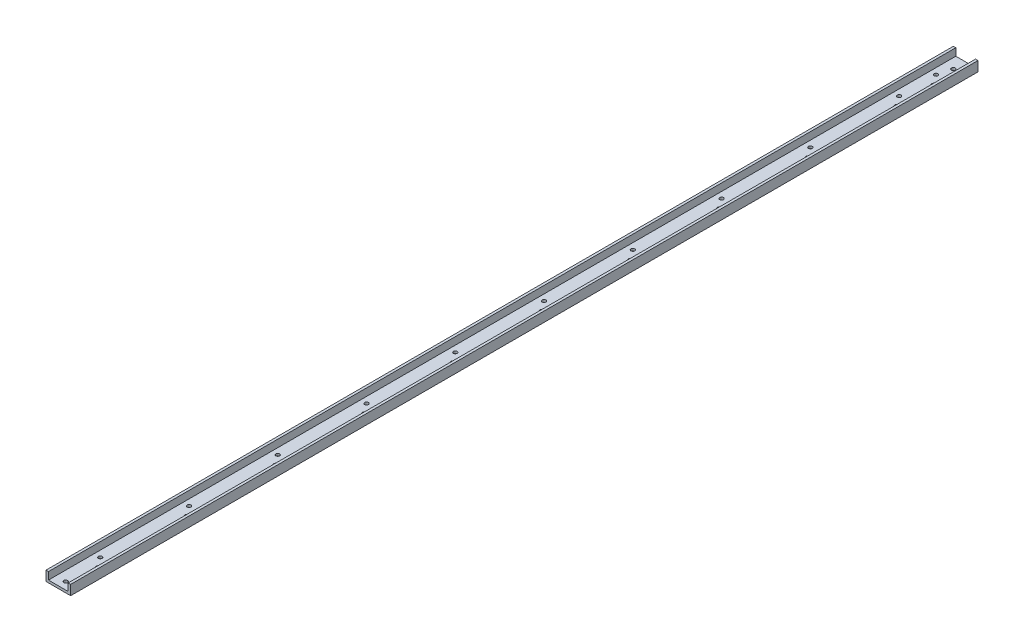
ISO-10303-21;
HEADER;
FILE_DESCRIPTION(('STEP AP214'),'2;1');
FILE_NAME('part.step','',(''),(''),'','','');
FILE_SCHEMA(('AUTOMOTIVE_DESIGN { 1 0 10303 214 1 1 1 1 }'));
ENDSEC;
DATA;
#1=APPLICATION_CONTEXT('core data for automotive mechanical design processes');
#2=APPLICATION_PROTOCOL_DEFINITION('international standard','automotive_design',2000,#1);
#3=PRODUCT_CONTEXT('',#1,'mechanical');
#4=PRODUCT('Part','Part','',(#3));
#5=PRODUCT_RELATED_PRODUCT_CATEGORY('part','',(#4));
#6=PRODUCT_DEFINITION_FORMATION('','',#4);
#7=PRODUCT_DEFINITION_CONTEXT('part definition',#1,'design');
#8=PRODUCT_DEFINITION('design','',#6,#7);
#9=PRODUCT_DEFINITION_SHAPE('','',#8);
#10=(LENGTH_UNIT() NAMED_UNIT(*) SI_UNIT(.MILLI.,.METRE.));
#11=(NAMED_UNIT(*) PLANE_ANGLE_UNIT() SI_UNIT($,.RADIAN.));
#12=(NAMED_UNIT(*) SI_UNIT($,.STERADIAN.) SOLID_ANGLE_UNIT());
#13=UNCERTAINTY_MEASURE_WITH_UNIT(LENGTH_MEASURE(1.E-05),#10,'distance_accuracy_value','');
#14=(GEOMETRIC_REPRESENTATION_CONTEXT(3) GLOBAL_UNCERTAINTY_ASSIGNED_CONTEXT((#13)) GLOBAL_UNIT_ASSIGNED_CONTEXT((#10,
#11,#12)) REPRESENTATION_CONTEXT('',''));
#15=CARTESIAN_POINT('',(0.,0.,0.));
#16=DIRECTION('',(0.,0.,1.));
#17=DIRECTION('',(1.,0.,0.));
#18=AXIS2_PLACEMENT_3D('',#15,#16,#17);
#19=CARTESIAN_POINT('',(20.6375,-0.00100000000000013,93.6624999999999));
#20=DIRECTION('',(0.,1.,0.));
#21=DIRECTION('',(0.,0.,1.));
#22=AXIS2_PLACEMENT_3D('',#19,#20,#21);
#23=CYLINDRICAL_SURFACE('',#22,2.41300000000001);
#24=CARTESIAN_POINT('',(20.6375,3.175,93.6624999999999));
#25=DIRECTION('',(0.,1.,0.));
#26=DIRECTION('',(0.,0.,1.));
#27=AXIS2_PLACEMENT_3D('',#24,#25,#26);
#28=CIRCLE('',#27,2.41300000000001);
#29=CARTESIAN_POINT('',(20.6375,3.175,96.0754999999999));
#30=VERTEX_POINT('',#29);
#31=EDGE_CURVE('E47',#30,#30,#28,.T.);
#32=ORIENTED_EDGE('',*,*,#31,.T.);
#33=EDGE_LOOP('',(#32));
#34=FACE_BOUND('',#33,.T.);
#35=CARTESIAN_POINT('',(20.6375,0.,93.6624999999999));
#36=DIRECTION('',(0.,1.,0.));
#37=DIRECTION('',(0.,0.,1.));
#38=AXIS2_PLACEMENT_3D('',#35,#36,#37);
#39=CIRCLE('',#38,2.41300000000001);
#40=CARTESIAN_POINT('',(20.6375,0.,96.0754999999999));
#41=VERTEX_POINT('',#40);
#42=EDGE_CURVE('E11',#41,#41,#39,.F.);
#43=ORIENTED_EDGE('',*,*,#42,.T.);
#44=EDGE_LOOP('',(#43));
#45=FACE_BOUND('',#44,.T.);
#46=ADVANCED_FACE('F39',(#34,#45),#23,.F.);
#47=CARTESIAN_POINT('',(20.6375,-0.00100000000000013,207.9625));
#48=DIRECTION('',(0.,1.,0.));
#49=DIRECTION('',(0.,0.,1.));
#50=AXIS2_PLACEMENT_3D('',#47,#48,#49);
#51=CYLINDRICAL_SURFACE('',#50,2.41300000000001);
#52=CARTESIAN_POINT('',(20.6375,3.175,207.9625));
#53=DIRECTION('',(0.,1.,0.));
#54=DIRECTION('',(0.,0.,1.));
#55=AXIS2_PLACEMENT_3D('',#52,#53,#54);
#56=CIRCLE('',#55,2.41300000000001);
#57=CARTESIAN_POINT('',(20.6375,3.175,210.3755));
#58=VERTEX_POINT('',#57);
#59=EDGE_CURVE('E268',#58,#58,#56,.T.);
#60=ORIENTED_EDGE('',*,*,#59,.T.);
#61=EDGE_LOOP('',(#60));
#62=FACE_BOUND('',#61,.T.);
#63=CARTESIAN_POINT('',(20.6375,0.,207.9625));
#64=DIRECTION('',(0.,1.,0.));
#65=DIRECTION('',(0.,0.,1.));
#66=AXIS2_PLACEMENT_3D('',#63,#64,#65);
#67=CIRCLE('',#66,2.41300000000001);
#68=CARTESIAN_POINT('',(20.6375,0.,210.3755));
#69=VERTEX_POINT('',#68);
#70=EDGE_CURVE('E271',#69,#69,#67,.F.);
#71=ORIENTED_EDGE('',*,*,#70,.T.);
#72=EDGE_LOOP('',(#71));
#73=FACE_BOUND('',#72,.T.);
#74=ADVANCED_FACE('F294',(#62,#73),#51,.F.);
#75=CARTESIAN_POINT('',(20.6375,-0.00100000000000013,322.2625));
#76=DIRECTION('',(0.,1.,0.));
#77=DIRECTION('',(0.,0.,1.));
#78=AXIS2_PLACEMENT_3D('',#75,#76,#77);
#79=CYLINDRICAL_SURFACE('',#78,2.41300000000001);
#80=CARTESIAN_POINT('',(20.6375,3.175,322.2625));
#81=DIRECTION('',(0.,1.,0.));
#82=DIRECTION('',(0.,0.,1.));
#83=AXIS2_PLACEMENT_3D('',#80,#81,#82);
#84=CIRCLE('',#83,2.41300000000001);
#85=CARTESIAN_POINT('',(20.6375,3.175,324.6755));
#86=VERTEX_POINT('',#85);
#87=EDGE_CURVE('E262',#86,#86,#84,.T.);
#88=ORIENTED_EDGE('',*,*,#87,.T.);
#89=EDGE_LOOP('',(#88));
#90=FACE_BOUND('',#89,.T.);
#91=CARTESIAN_POINT('',(20.6375,0.,322.2625));
#92=DIRECTION('',(0.,1.,0.));
#93=DIRECTION('',(0.,0.,1.));
#94=AXIS2_PLACEMENT_3D('',#91,#92,#93);
#95=CIRCLE('',#94,2.41300000000001);
#96=CARTESIAN_POINT('',(20.6375,0.,324.6755));
#97=VERTEX_POINT('',#96);
#98=EDGE_CURVE('E265',#97,#97,#95,.F.);
#99=ORIENTED_EDGE('',*,*,#98,.T.);
#100=EDGE_LOOP('',(#99));
#101=FACE_BOUND('',#100,.T.);
#102=ADVANCED_FACE('F298',(#90,#101),#79,.F.);
#103=CARTESIAN_POINT('',(20.6375,-0.00100000000000013,436.5625));
#104=DIRECTION('',(0.,1.,0.));
#105=DIRECTION('',(0.,0.,1.));
#106=AXIS2_PLACEMENT_3D('',#103,#104,#105);
#107=CYLINDRICAL_SURFACE('',#106,2.41300000000001);
#108=CARTESIAN_POINT('',(20.6375,3.175,436.5625));
#109=DIRECTION('',(0.,1.,0.));
#110=DIRECTION('',(0.,0.,1.));
#111=AXIS2_PLACEMENT_3D('',#108,#109,#110);
#112=CIRCLE('',#111,2.41300000000001);
#113=CARTESIAN_POINT('',(20.6375,3.175,438.9755));
#114=VERTEX_POINT('',#113);
#115=EDGE_CURVE('E256',#114,#114,#112,.T.);
#116=ORIENTED_EDGE('',*,*,#115,.T.);
#117=EDGE_LOOP('',(#116));
#118=FACE_BOUND('',#117,.T.);
#119=CARTESIAN_POINT('',(20.6375,0.,436.5625));
#120=DIRECTION('',(0.,1.,0.));
#121=DIRECTION('',(0.,0.,1.));
#122=AXIS2_PLACEMENT_3D('',#119,#120,#121);
#123=CIRCLE('',#122,2.41300000000001);
#124=CARTESIAN_POINT('',(20.6375,0.,438.9755));
#125=VERTEX_POINT('',#124);
#126=EDGE_CURVE('E259',#125,#125,#123,.F.);
#127=ORIENTED_EDGE('',*,*,#126,.T.);
#128=EDGE_LOOP('',(#127));
#129=FACE_BOUND('',#128,.T.);
#130=ADVANCED_FACE('F303',(#118,#129),#107,.F.);
#131=CARTESIAN_POINT('',(20.6375,-0.00100000000000013,550.8625));
#132=DIRECTION('',(0.,1.,0.));
#133=DIRECTION('',(0.,0.,1.));
#134=AXIS2_PLACEMENT_3D('',#131,#132,#133);
#135=CYLINDRICAL_SURFACE('',#134,2.41300000000001);
#136=CARTESIAN_POINT('',(20.6375,3.175,550.8625));
#137=DIRECTION('',(0.,1.,0.));
#138=DIRECTION('',(0.,0.,1.));
#139=AXIS2_PLACEMENT_3D('',#136,#137,#138);
#140=CIRCLE('',#139,2.41300000000001);
#141=CARTESIAN_POINT('',(20.6375,3.175,553.2755));
#142=VERTEX_POINT('',#141);
#143=EDGE_CURVE('E250',#142,#142,#140,.T.);
#144=ORIENTED_EDGE('',*,*,#143,.T.);
#145=EDGE_LOOP('',(#144));
#146=FACE_BOUND('',#145,.T.);
#147=CARTESIAN_POINT('',(20.6375,0.,550.8625));
#148=DIRECTION('',(0.,1.,0.));
#149=DIRECTION('',(0.,0.,1.));
#150=AXIS2_PLACEMENT_3D('',#147,#148,#149);
#151=CIRCLE('',#150,2.41300000000001);
#152=CARTESIAN_POINT('',(20.6375,0.,553.2755));
#153=VERTEX_POINT('',#152);
#154=EDGE_CURVE('E253',#153,#153,#151,.F.);
#155=ORIENTED_EDGE('',*,*,#154,.T.);
#156=EDGE_LOOP('',(#155));
#157=FACE_BOUND('',#156,.T.);
#158=ADVANCED_FACE('F310',(#146,#157),#135,.F.);
#159=CARTESIAN_POINT('',(20.6375,-0.00100000000000013,665.1625));
#160=DIRECTION('',(0.,1.,0.));
#161=DIRECTION('',(0.,0.,1.));
#162=AXIS2_PLACEMENT_3D('',#159,#160,#161);
#163=CYLINDRICAL_SURFACE('',#162,2.41300000000001);
#164=CARTESIAN_POINT('',(20.6375,3.175,665.1625));
#165=DIRECTION('',(0.,1.,0.));
#166=DIRECTION('',(0.,0.,1.));
#167=AXIS2_PLACEMENT_3D('',#164,#165,#166);
#168=CIRCLE('',#167,2.41300000000001);
#169=CARTESIAN_POINT('',(20.6375,3.175,667.5755));
#170=VERTEX_POINT('',#169);
#171=EDGE_CURVE('E244',#170,#170,#168,.T.);
#172=ORIENTED_EDGE('',*,*,#171,.T.);
#173=EDGE_LOOP('',(#172));
#174=FACE_BOUND('',#173,.T.);
#175=CARTESIAN_POINT('',(20.6375,0.,665.1625));
#176=DIRECTION('',(0.,1.,0.));
#177=DIRECTION('',(0.,0.,1.));
#178=AXIS2_PLACEMENT_3D('',#175,#176,#177);
#179=CIRCLE('',#178,2.41300000000001);
#180=CARTESIAN_POINT('',(20.6375,0.,667.5755));
#181=VERTEX_POINT('',#180);
#182=EDGE_CURVE('E247',#181,#181,#179,.F.);
#183=ORIENTED_EDGE('',*,*,#182,.T.);
#184=EDGE_LOOP('',(#183));
#185=FACE_BOUND('',#184,.T.);
#186=ADVANCED_FACE('F314',(#174,#185),#163,.F.);
#187=CARTESIAN_POINT('',(20.6375,-0.00100000000000013,779.4625));
#188=DIRECTION('',(0.,1.,0.));
#189=DIRECTION('',(0.,0.,1.));
#190=AXIS2_PLACEMENT_3D('',#187,#188,#189);
#191=CYLINDRICAL_SURFACE('',#190,2.41300000000001);
#192=CARTESIAN_POINT('',(20.6375,3.175,779.4625));
#193=DIRECTION('',(0.,1.,0.));
#194=DIRECTION('',(0.,0.,1.));
#195=AXIS2_PLACEMENT_3D('',#192,#193,#194);
#196=CIRCLE('',#195,2.41300000000001);
#197=CARTESIAN_POINT('',(20.6375,3.175,781.8755));
#198=VERTEX_POINT('',#197);
#199=EDGE_CURVE('E238',#198,#198,#196,.T.);
#200=ORIENTED_EDGE('',*,*,#199,.T.);
#201=EDGE_LOOP('',(#200));
#202=FACE_BOUND('',#201,.T.);
#203=CARTESIAN_POINT('',(20.6375,0.,779.4625));
#204=DIRECTION('',(0.,1.,0.));
#205=DIRECTION('',(0.,0.,1.));
#206=AXIS2_PLACEMENT_3D('',#203,#204,#205);
#207=CIRCLE('',#206,2.41300000000001);
#208=CARTESIAN_POINT('',(20.6375,0.,781.8755));
#209=VERTEX_POINT('',#208);
#210=EDGE_CURVE('E241',#209,#209,#207,.F.);
#211=ORIENTED_EDGE('',*,*,#210,.T.);
#212=EDGE_LOOP('',(#211));
#213=FACE_BOUND('',#212,.T.);
#214=ADVANCED_FACE('F318',(#202,#213),#191,.F.);
#215=CARTESIAN_POINT('',(20.6375,-0.00100000000000013,893.7625));
#216=DIRECTION('',(0.,1.,0.));
#217=DIRECTION('',(0.,0.,1.));
#218=AXIS2_PLACEMENT_3D('',#215,#216,#217);
#219=CYLINDRICAL_SURFACE('',#218,2.41300000000001);
#220=CARTESIAN_POINT('',(20.6375,3.175,893.7625));
#221=DIRECTION('',(0.,1.,0.));
#222=DIRECTION('',(0.,0.,1.));
#223=AXIS2_PLACEMENT_3D('',#220,#221,#222);
#224=CIRCLE('',#223,2.41300000000001);
#225=CARTESIAN_POINT('',(20.6375,3.175,896.1755));
#226=VERTEX_POINT('',#225);
#227=EDGE_CURVE('E232',#226,#226,#224,.T.);
#228=ORIENTED_EDGE('',*,*,#227,.T.);
#229=EDGE_LOOP('',(#228));
#230=FACE_BOUND('',#229,.T.);
#231=CARTESIAN_POINT('',(20.6375,0.,893.7625));
#232=DIRECTION('',(0.,1.,0.));
#233=DIRECTION('',(0.,0.,1.));
#234=AXIS2_PLACEMENT_3D('',#231,#232,#233);
#235=CIRCLE('',#234,2.41300000000001);
#236=CARTESIAN_POINT('',(20.6375,0.,896.1755));
#237=VERTEX_POINT('',#236);
#238=EDGE_CURVE('E235',#237,#237,#235,.F.);
#239=ORIENTED_EDGE('',*,*,#238,.T.);
#240=EDGE_LOOP('',(#239));
#241=FACE_BOUND('',#240,.T.);
#242=ADVANCED_FACE('F322',(#230,#241),#219,.F.);
#243=CARTESIAN_POINT('',(11.1125,-0.00100000000000013,80.9625));
#244=DIRECTION('',(0.,1.,0.));
#245=DIRECTION('',(0.,0.,1.));
#246=AXIS2_PLACEMENT_3D('',#243,#244,#245);
#247=CYLINDRICAL_SURFACE('',#246,2.41300000000005);
#248=CARTESIAN_POINT('',(11.1125,3.175,80.9625));
#249=DIRECTION('',(0.,1.,0.));
#250=DIRECTION('',(0.,0.,1.));
#251=AXIS2_PLACEMENT_3D('',#248,#249,#250);
#252=CIRCLE('',#251,2.41300000000005);
#253=CARTESIAN_POINT('',(11.1125,3.175,83.3755000000001));
#254=VERTEX_POINT('',#253);
#255=EDGE_CURVE('E226',#254,#254,#252,.T.);
#256=ORIENTED_EDGE('',*,*,#255,.T.);
#257=EDGE_LOOP('',(#256));
#258=FACE_BOUND('',#257,.T.);
#259=CARTESIAN_POINT('',(11.1125,0.,80.9625));
#260=DIRECTION('',(0.,1.,0.));
#261=DIRECTION('',(0.,0.,1.));
#262=AXIS2_PLACEMENT_3D('',#259,#260,#261);
#263=CIRCLE('',#262,2.41300000000005);
#264=CARTESIAN_POINT('',(11.1125,0.,83.3755000000001));
#265=VERTEX_POINT('',#264);
#266=EDGE_CURVE('E229',#265,#265,#263,.F.);
#267=ORIENTED_EDGE('',*,*,#266,.T.);
#268=EDGE_LOOP('',(#267));
#269=FACE_BOUND('',#268,.T.);
#270=ADVANCED_FACE('F326',(#258,#269),#247,.F.);
#271=CARTESIAN_POINT('',(11.1125,-0.00100000000000013,195.2625));
#272=DIRECTION('',(0.,1.,0.));
#273=DIRECTION('',(0.,0.,1.));
#274=AXIS2_PLACEMENT_3D('',#271,#272,#273);
#275=CYLINDRICAL_SURFACE('',#274,2.41300000000005);
#276=CARTESIAN_POINT('',(11.1125,3.175,195.2625));
#277=DIRECTION('',(0.,1.,0.));
#278=DIRECTION('',(0.,0.,1.));
#279=AXIS2_PLACEMENT_3D('',#276,#277,#278);
#280=CIRCLE('',#279,2.41300000000005);
#281=CARTESIAN_POINT('',(11.1125,3.175,197.6755));
#282=VERTEX_POINT('',#281);
#283=EDGE_CURVE('E220',#282,#282,#280,.T.);
#284=ORIENTED_EDGE('',*,*,#283,.T.);
#285=EDGE_LOOP('',(#284));
#286=FACE_BOUND('',#285,.T.);
#287=CARTESIAN_POINT('',(11.1125,0.,195.2625));
#288=DIRECTION('',(0.,1.,0.));
#289=DIRECTION('',(0.,0.,1.));
#290=AXIS2_PLACEMENT_3D('',#287,#288,#289);
#291=CIRCLE('',#290,2.41300000000005);
#292=CARTESIAN_POINT('',(11.1125,0.,197.6755));
#293=VERTEX_POINT('',#292);
#294=EDGE_CURVE('E223',#293,#293,#291,.F.);
#295=ORIENTED_EDGE('',*,*,#294,.T.);
#296=EDGE_LOOP('',(#295));
#297=FACE_BOUND('',#296,.T.);
#298=ADVANCED_FACE('F330',(#286,#297),#275,.F.);
#299=CARTESIAN_POINT('',(11.1125,-0.00100000000000013,309.5625));
#300=DIRECTION('',(0.,1.,0.));
#301=DIRECTION('',(0.,0.,1.));
#302=AXIS2_PLACEMENT_3D('',#299,#300,#301);
#303=CYLINDRICAL_SURFACE('',#302,2.41300000000005);
#304=CARTESIAN_POINT('',(11.1125,3.175,309.5625));
#305=DIRECTION('',(0.,1.,0.));
#306=DIRECTION('',(0.,0.,1.));
#307=AXIS2_PLACEMENT_3D('',#304,#305,#306);
#308=CIRCLE('',#307,2.41300000000005);
#309=CARTESIAN_POINT('',(11.1125,3.175,311.9755));
#310=VERTEX_POINT('',#309);
#311=EDGE_CURVE('E214',#310,#310,#308,.T.);
#312=ORIENTED_EDGE('',*,*,#311,.T.);
#313=EDGE_LOOP('',(#312));
#314=FACE_BOUND('',#313,.T.);
#315=CARTESIAN_POINT('',(11.1125,0.,309.5625));
#316=DIRECTION('',(0.,1.,0.));
#317=DIRECTION('',(0.,0.,1.));
#318=AXIS2_PLACEMENT_3D('',#315,#316,#317);
#319=CIRCLE('',#318,2.41300000000005);
#320=CARTESIAN_POINT('',(11.1125,0.,311.9755));
#321=VERTEX_POINT('',#320);
#322=EDGE_CURVE('E217',#321,#321,#319,.F.);
#323=ORIENTED_EDGE('',*,*,#322,.T.);
#324=EDGE_LOOP('',(#323));
#325=FACE_BOUND('',#324,.T.);
#326=ADVANCED_FACE('F334',(#314,#325),#303,.F.);
#327=CARTESIAN_POINT('',(11.1125,-0.00100000000000013,423.8625));
#328=DIRECTION('',(0.,1.,0.));
#329=DIRECTION('',(0.,0.,1.));
#330=AXIS2_PLACEMENT_3D('',#327,#328,#329);
#331=CYLINDRICAL_SURFACE('',#330,2.41300000000005);
#332=CARTESIAN_POINT('',(11.1125,3.175,423.8625));
#333=DIRECTION('',(0.,1.,0.));
#334=DIRECTION('',(0.,0.,1.));
#335=AXIS2_PLACEMENT_3D('',#332,#333,#334);
#336=CIRCLE('',#335,2.41300000000005);
#337=CARTESIAN_POINT('',(11.1125,3.175,426.2755));
#338=VERTEX_POINT('',#337);
#339=EDGE_CURVE('E208',#338,#338,#336,.T.);
#340=ORIENTED_EDGE('',*,*,#339,.T.);
#341=EDGE_LOOP('',(#340));
#342=FACE_BOUND('',#341,.T.);
#343=CARTESIAN_POINT('',(11.1125,0.,423.8625));
#344=DIRECTION('',(0.,1.,0.));
#345=DIRECTION('',(0.,0.,1.));
#346=AXIS2_PLACEMENT_3D('',#343,#344,#345);
#347=CIRCLE('',#346,2.41300000000005);
#348=CARTESIAN_POINT('',(11.1125,0.,426.2755));
#349=VERTEX_POINT('',#348);
#350=EDGE_CURVE('E211',#349,#349,#347,.F.);
#351=ORIENTED_EDGE('',*,*,#350,.T.);
#352=EDGE_LOOP('',(#351));
#353=FACE_BOUND('',#352,.T.);
#354=ADVANCED_FACE('F338',(#342,#353),#331,.F.);
#355=CARTESIAN_POINT('',(11.1125,-0.00100000000000013,538.1625));
#356=DIRECTION('',(0.,1.,0.));
#357=DIRECTION('',(0.,0.,1.));
#358=AXIS2_PLACEMENT_3D('',#355,#356,#357);
#359=CYLINDRICAL_SURFACE('',#358,2.41300000000005);
#360=CARTESIAN_POINT('',(11.1125,3.175,538.1625));
#361=DIRECTION('',(0.,1.,0.));
#362=DIRECTION('',(0.,0.,1.));
#363=AXIS2_PLACEMENT_3D('',#360,#361,#362);
#364=CIRCLE('',#363,2.41300000000005);
#365=CARTESIAN_POINT('',(11.1125,3.175,540.5755));
#366=VERTEX_POINT('',#365);
#367=EDGE_CURVE('E202',#366,#366,#364,.T.);
#368=ORIENTED_EDGE('',*,*,#367,.T.);
#369=EDGE_LOOP('',(#368));
#370=FACE_BOUND('',#369,.T.);
#371=CARTESIAN_POINT('',(11.1125,0.,538.1625));
#372=DIRECTION('',(0.,1.,0.));
#373=DIRECTION('',(0.,0.,1.));
#374=AXIS2_PLACEMENT_3D('',#371,#372,#373);
#375=CIRCLE('',#374,2.41300000000005);
#376=CARTESIAN_POINT('',(11.1125,0.,540.5755));
#377=VERTEX_POINT('',#376);
#378=EDGE_CURVE('E205',#377,#377,#375,.F.);
#379=ORIENTED_EDGE('',*,*,#378,.T.);
#380=EDGE_LOOP('',(#379));
#381=FACE_BOUND('',#380,.T.);
#382=ADVANCED_FACE('F342',(#370,#381),#359,.F.);
#383=CARTESIAN_POINT('',(11.1125,-0.00100000000000013,652.4625));
#384=DIRECTION('',(0.,1.,0.));
#385=DIRECTION('',(0.,0.,1.));
#386=AXIS2_PLACEMENT_3D('',#383,#384,#385);
#387=CYLINDRICAL_SURFACE('',#386,2.41300000000005);
#388=CARTESIAN_POINT('',(11.1125,3.175,652.4625));
#389=DIRECTION('',(0.,1.,0.));
#390=DIRECTION('',(0.,0.,1.));
#391=AXIS2_PLACEMENT_3D('',#388,#389,#390);
#392=CIRCLE('',#391,2.41300000000005);
#393=CARTESIAN_POINT('',(11.1125,3.175,654.8755));
#394=VERTEX_POINT('',#393);
#395=EDGE_CURVE('E196',#394,#394,#392,.T.);
#396=ORIENTED_EDGE('',*,*,#395,.T.);
#397=EDGE_LOOP('',(#396));
#398=FACE_BOUND('',#397,.T.);
#399=CARTESIAN_POINT('',(11.1125,0.,652.4625));
#400=DIRECTION('',(0.,1.,0.));
#401=DIRECTION('',(0.,0.,1.));
#402=AXIS2_PLACEMENT_3D('',#399,#400,#401);
#403=CIRCLE('',#402,2.41300000000005);
#404=CARTESIAN_POINT('',(11.1125,0.,654.8755));
#405=VERTEX_POINT('',#404);
#406=EDGE_CURVE('E199',#405,#405,#403,.F.);
#407=ORIENTED_EDGE('',*,*,#406,.T.);
#408=EDGE_LOOP('',(#407));
#409=FACE_BOUND('',#408,.T.);
#410=ADVANCED_FACE('F346',(#398,#409),#387,.F.);
#411=CARTESIAN_POINT('',(11.1125,-0.00100000000000013,766.7625));
#412=DIRECTION('',(0.,1.,0.));
#413=DIRECTION('',(0.,0.,1.));
#414=AXIS2_PLACEMENT_3D('',#411,#412,#413);
#415=CYLINDRICAL_SURFACE('',#414,2.41300000000005);
#416=CARTESIAN_POINT('',(11.1125,3.175,766.7625));
#417=DIRECTION('',(0.,1.,0.));
#418=DIRECTION('',(0.,0.,1.));
#419=AXIS2_PLACEMENT_3D('',#416,#417,#418);
#420=CIRCLE('',#419,2.41300000000005);
#421=CARTESIAN_POINT('',(11.1125,3.175,769.1755));
#422=VERTEX_POINT('',#421);
#423=EDGE_CURVE('E190',#422,#422,#420,.T.);
#424=ORIENTED_EDGE('',*,*,#423,.T.);
#425=EDGE_LOOP('',(#424));
#426=FACE_BOUND('',#425,.T.);
#427=CARTESIAN_POINT('',(11.1125,0.,766.7625));
#428=DIRECTION('',(0.,1.,0.));
#429=DIRECTION('',(0.,0.,1.));
#430=AXIS2_PLACEMENT_3D('',#427,#428,#429);
#431=CIRCLE('',#430,2.41300000000005);
#432=CARTESIAN_POINT('',(11.1125,0.,769.1755));
#433=VERTEX_POINT('',#432);
#434=EDGE_CURVE('E193',#433,#433,#431,.F.);
#435=ORIENTED_EDGE('',*,*,#434,.T.);
#436=EDGE_LOOP('',(#435));
#437=FACE_BOUND('',#436,.T.);
#438=ADVANCED_FACE('F350',(#426,#437),#415,.F.);
#439=CARTESIAN_POINT('',(11.1125,-0.00100000000000013,881.0625));
#440=DIRECTION('',(0.,1.,0.));
#441=DIRECTION('',(0.,0.,1.));
#442=AXIS2_PLACEMENT_3D('',#439,#440,#441);
#443=CYLINDRICAL_SURFACE('',#442,2.41300000000005);
#444=CARTESIAN_POINT('',(11.1125,3.175,881.0625));
#445=DIRECTION('',(0.,1.,0.));
#446=DIRECTION('',(0.,0.,1.));
#447=AXIS2_PLACEMENT_3D('',#444,#445,#446);
#448=CIRCLE('',#447,2.41300000000005);
#449=CARTESIAN_POINT('',(11.1125,3.175,883.4755));
#450=VERTEX_POINT('',#449);
#451=EDGE_CURVE('E184',#450,#450,#448,.T.);
#452=ORIENTED_EDGE('',*,*,#451,.T.);
#453=EDGE_LOOP('',(#452));
#454=FACE_BOUND('',#453,.T.);
#455=CARTESIAN_POINT('',(11.1125,0.,881.0625));
#456=DIRECTION('',(0.,1.,0.));
#457=DIRECTION('',(0.,0.,1.));
#458=AXIS2_PLACEMENT_3D('',#455,#456,#457);
#459=CIRCLE('',#458,2.41300000000005);
#460=CARTESIAN_POINT('',(11.1125,0.,883.4755));
#461=VERTEX_POINT('',#460);
#462=EDGE_CURVE('E187',#461,#461,#459,.F.);
#463=ORIENTED_EDGE('',*,*,#462,.T.);
#464=EDGE_LOOP('',(#463));
#465=FACE_BOUND('',#464,.T.);
#466=ADVANCED_FACE('F354',(#454,#465),#443,.F.);
#467=CARTESIAN_POINT('',(0.,0.,1168.4));
#468=DIRECTION('',(1.,0.,0.));
#469=DIRECTION('',(0.,0.,-1.));
#470=AXIS2_PLACEMENT_3D('',#467,#468,#469);
#471=PLANE('',#470);
#472=DIRECTION('',(0.,-1.,0.));
#473=VECTOR('',#472,1.);
#474=CARTESIAN_POINT('',(0.,0.,0.));
#475=LINE('',#474,#473);
#476=CARTESIAN_POINT('',(0.,12.7,0.));
#477=VERTEX_POINT('',#476);
#478=CARTESIAN_POINT('',(0.,0.,0.));
#479=VERTEX_POINT('',#478);
#480=EDGE_CURVE('E142',#477,#479,#475,.T.);
#481=ORIENTED_EDGE('',*,*,#480,.T.);
#482=DIRECTION('',(0.,0.,-1.));
#483=VECTOR('',#482,1.);
#484=CARTESIAN_POINT('',(0.,0.,1168.4));
#485=LINE('',#484,#483);
#486=CARTESIAN_POINT('',(0.,0.,1168.4));
#487=VERTEX_POINT('',#486);
#488=EDGE_CURVE('E181',#487,#479,#485,.T.);
#489=ORIENTED_EDGE('',*,*,#488,.F.);
#490=DIRECTION('',(0.,-1.,0.));
#491=VECTOR('',#490,1.);
#492=CARTESIAN_POINT('',(0.,0.,1168.4));
#493=LINE('',#492,#491);
#494=CARTESIAN_POINT('',(0.,12.7,1168.4));
#495=VERTEX_POINT('',#494);
#496=EDGE_CURVE('E162',#495,#487,#493,.T.);
#497=ORIENTED_EDGE('',*,*,#496,.F.);
#498=DIRECTION('',(0.,0.,-1.));
#499=VECTOR('',#498,1.);
#500=CARTESIAN_POINT('',(0.,12.7,1168.4));
#501=LINE('',#500,#499);
#502=EDGE_CURVE('E138',#495,#477,#501,.T.);
#503=ORIENTED_EDGE('',*,*,#502,.T.);
#504=EDGE_LOOP('',(#481,#489,#497,#503));
#505=FACE_BOUND('',#504,.T.);
#506=ADVANCED_FACE('F358',(#505),#471,.F.);
#507=CARTESIAN_POINT('',(0.,0.,1168.4));
#508=DIRECTION('',(0.,1.,0.));
#509=DIRECTION('',(0.,0.,1.));
#510=AXIS2_PLACEMENT_3D('',#507,#508,#509);
#511=PLANE('',#510);
#512=CARTESIAN_POINT('',(15.875,0.,15.875));
#513=DIRECTION('',(0.,1.,0.));
#514=DIRECTION('',(0.,0.,1.));
#515=AXIS2_PLACEMENT_3D('',#512,#513,#514);
#516=CIRCLE('',#515,2.413);
#517=CARTESIAN_POINT('',(15.875,0.,18.288));
#518=VERTEX_POINT('',#517);
#519=EDGE_CURVE('E430',#518,#518,#516,.F.);
#520=ORIENTED_EDGE('',*,*,#519,.F.);
#521=EDGE_LOOP('',(#520));
#522=FACE_BOUND('',#521,.T.);
#523=CARTESIAN_POINT('',(11.1125000000001,0.,33.3374999999999));
#524=DIRECTION('',(0.,-1.,0.));
#525=DIRECTION('',(0.,0.,-1.));
#526=AXIS2_PLACEMENT_3D('',#523,#524,#525);
#527=CIRCLE('',#526,2.413);
#528=CARTESIAN_POINT('',(11.1125000000001,0.,30.9245));
#529=VERTEX_POINT('',#528);
#530=EDGE_CURVE('E440',#529,#529,#527,.T.);
#531=ORIENTED_EDGE('',*,*,#530,.F.);
#532=EDGE_LOOP('',(#531));
#533=FACE_BOUND('',#532,.T.);
#534=CARTESIAN_POINT('',(20.6375000000001,0.,46.0374999999999));
#535=DIRECTION('',(0.,-1.,0.));
#536=DIRECTION('',(0.,0.,-1.));
#537=AXIS2_PLACEMENT_3D('',#534,#535,#536);
#538=CIRCLE('',#537,2.413);
#539=CARTESIAN_POINT('',(20.6375000000001,0.,43.6244999999999));
#540=VERTEX_POINT('',#539);
#541=EDGE_CURVE('E432',#540,#540,#538,.T.);
#542=ORIENTED_EDGE('',*,*,#541,.F.);
#543=EDGE_LOOP('',(#542));
#544=FACE_BOUND('',#543,.T.);
#545=CARTESIAN_POINT('',(20.6375,0.,1008.0625));
#546=DIRECTION('',(0.,1.,0.));
#547=DIRECTION('',(0.,0.,1.));
#548=AXIS2_PLACEMENT_3D('',#545,#546,#547);
#549=CIRCLE('',#548,2.41300000000001);
#550=CARTESIAN_POINT('',(20.6375,0.,1010.4755));
#551=VERTEX_POINT('',#550);
#552=EDGE_CURVE('E451',#551,#551,#549,.F.);
#553=ORIENTED_EDGE('',*,*,#552,.F.);
#554=EDGE_LOOP('',(#553));
#555=FACE_BOUND('',#554,.T.);
#556=CARTESIAN_POINT('',(11.1125,0.,995.3625));
#557=DIRECTION('',(0.,1.,0.));
#558=DIRECTION('',(0.,0.,1.));
#559=AXIS2_PLACEMENT_3D('',#556,#557,#558);
#560=CIRCLE('',#559,2.41300000000005);
#561=CARTESIAN_POINT('',(11.1125,0.,997.7755));
#562=VERTEX_POINT('',#561);
#563=EDGE_CURVE('E457',#562,#562,#560,.F.);
#564=ORIENTED_EDGE('',*,*,#563,.F.);
#565=EDGE_LOOP('',(#564));
#566=FACE_BOUND('',#565,.T.);
#567=CARTESIAN_POINT('',(15.875,0.,1158.875));
#568=DIRECTION('',(0.,1.,0.));
#569=DIRECTION('',(0.,0.,1.));
#570=AXIS2_PLACEMENT_3D('',#567,#568,#569);
#571=CIRCLE('',#570,2.41299999999998);
#572=CARTESIAN_POINT('',(15.875,0.,1161.288));
#573=VERTEX_POINT('',#572);
#574=EDGE_CURVE('E463',#573,#573,#571,.F.);
#575=ORIENTED_EDGE('',*,*,#574,.F.);
#576=EDGE_LOOP('',(#575));
#577=FACE_BOUND('',#576,.T.);
#578=CARTESIAN_POINT('',(11.1125,0.,1109.6625));
#579=DIRECTION('',(0.,1.,0.));
#580=DIRECTION('',(0.,0.,1.));
#581=AXIS2_PLACEMENT_3D('',#578,#579,#580);
#582=CIRCLE('',#581,2.41300000000005);
#583=CARTESIAN_POINT('',(11.1125,0.,1112.0755));
#584=VERTEX_POINT('',#583);
#585=EDGE_CURVE('E146',#584,#584,#582,.F.);
#586=ORIENTED_EDGE('',*,*,#585,.F.);
#587=EDGE_LOOP('',(#586));
#588=FACE_BOUND('',#587,.T.);
#589=CARTESIAN_POINT('',(20.6375,0.,1122.3625));
#590=DIRECTION('',(0.,1.,0.));
#591=DIRECTION('',(0.,0.,1.));
#592=AXIS2_PLACEMENT_3D('',#589,#590,#591);
#593=CIRCLE('',#592,2.41300000000001);
#594=CARTESIAN_POINT('',(20.6375,0.,1124.7755));
#595=VERTEX_POINT('',#594);
#596=EDGE_CURVE('E470',#595,#595,#593,.F.);
#597=ORIENTED_EDGE('',*,*,#596,.F.);
#598=EDGE_LOOP('',(#597));
#599=FACE_BOUND('',#598,.T.);
#600=DIRECTION('',(1.,0.,0.));
#601=VECTOR('',#600,1.);
#602=CARTESIAN_POINT('',(0.,0.,0.));
#603=LINE('',#602,#601);
#604=CARTESIAN_POINT('',(31.75,0.,0.));
#605=VERTEX_POINT('',#604);
#606=EDGE_CURVE('E145',#479,#605,#603,.T.);
#607=ORIENTED_EDGE('',*,*,#606,.T.);
#608=DIRECTION('',(0.,0.,-1.));
#609=VECTOR('',#608,1.);
#610=CARTESIAN_POINT('',(31.75,0.,1168.4));
#611=LINE('',#610,#609);
#612=CARTESIAN_POINT('',(31.75,0.,1168.4));
#613=VERTEX_POINT('',#612);
#614=EDGE_CURVE('E177',#613,#605,#611,.T.);
#615=ORIENTED_EDGE('',*,*,#614,.F.);
#616=DIRECTION('',(1.,0.,0.));
#617=VECTOR('',#616,1.);
#618=CARTESIAN_POINT('',(0.,0.,1168.4));
#619=LINE('',#618,#617);
#620=EDGE_CURVE('E103',#487,#613,#619,.T.);
#621=ORIENTED_EDGE('',*,*,#620,.F.);
#622=ORIENTED_EDGE('',*,*,#488,.T.);
#623=EDGE_LOOP('',(#607,#615,#621,#622));
#624=FACE_BOUND('',#623,.T.);
#625=ORIENTED_EDGE('',*,*,#462,.F.);
#626=EDGE_LOOP('',(#625));
#627=FACE_BOUND('',#626,.T.);
#628=ORIENTED_EDGE('',*,*,#434,.F.);
#629=EDGE_LOOP('',(#628));
#630=FACE_BOUND('',#629,.T.);
#631=ORIENTED_EDGE('',*,*,#406,.F.);
#632=EDGE_LOOP('',(#631));
#633=FACE_BOUND('',#632,.T.);
#634=ORIENTED_EDGE('',*,*,#378,.F.);
#635=EDGE_LOOP('',(#634));
#636=FACE_BOUND('',#635,.T.);
#637=ORIENTED_EDGE('',*,*,#350,.F.);
#638=EDGE_LOOP('',(#637));
#639=FACE_BOUND('',#638,.T.);
#640=ORIENTED_EDGE('',*,*,#322,.F.);
#641=EDGE_LOOP('',(#640));
#642=FACE_BOUND('',#641,.T.);
#643=ORIENTED_EDGE('',*,*,#294,.F.);
#644=EDGE_LOOP('',(#643));
#645=FACE_BOUND('',#644,.T.);
#646=ORIENTED_EDGE('',*,*,#266,.F.);
#647=EDGE_LOOP('',(#646));
#648=FACE_BOUND('',#647,.T.);
#649=ORIENTED_EDGE('',*,*,#238,.F.);
#650=EDGE_LOOP('',(#649));
#651=FACE_BOUND('',#650,.T.);
#652=ORIENTED_EDGE('',*,*,#210,.F.);
#653=EDGE_LOOP('',(#652));
#654=FACE_BOUND('',#653,.T.);
#655=ORIENTED_EDGE('',*,*,#182,.F.);
#656=EDGE_LOOP('',(#655));
#657=FACE_BOUND('',#656,.T.);
#658=ORIENTED_EDGE('',*,*,#154,.F.);
#659=EDGE_LOOP('',(#658));
#660=FACE_BOUND('',#659,.T.);
#661=ORIENTED_EDGE('',*,*,#126,.F.);
#662=EDGE_LOOP('',(#661));
#663=FACE_BOUND('',#662,.T.);
#664=ORIENTED_EDGE('',*,*,#98,.F.);
#665=EDGE_LOOP('',(#664));
#666=FACE_BOUND('',#665,.T.);
#667=ORIENTED_EDGE('',*,*,#70,.F.);
#668=EDGE_LOOP('',(#667));
#669=FACE_BOUND('',#668,.T.);
#670=ORIENTED_EDGE('',*,*,#42,.F.);
#671=EDGE_LOOP('',(#670));
#672=FACE_BOUND('',#671,.T.);
#673=ADVANCED_FACE('F362',(#522,#533,#544,#555,#566,#577,#588,#599,#624,#627,#630,#633,#636,
#639,#642,#645,#648,#651,#654,#657,#660,#663,#666,#669,#672),#511,.F.);
#674=CARTESIAN_POINT('',(31.75,0.,1168.4));
#675=DIRECTION('',(-1.,0.,0.));
#676=DIRECTION('',(0.,0.,1.));
#677=AXIS2_PLACEMENT_3D('',#674,#675,#676);
#678=PLANE('',#677);
#679=DIRECTION('',(0.,1.,0.));
#680=VECTOR('',#679,1.);
#681=CARTESIAN_POINT('',(31.75,0.,0.));
#682=LINE('',#681,#680);
#683=CARTESIAN_POINT('',(31.75,12.7,0.));
#684=VERTEX_POINT('',#683);
#685=EDGE_CURVE('E149',#605,#684,#682,.T.);
#686=ORIENTED_EDGE('',*,*,#685,.T.);
#687=DIRECTION('',(0.,0.,-1.));
#688=VECTOR('',#687,1.);
#689=CARTESIAN_POINT('',(31.75,12.7,1168.4));
#690=LINE('',#689,#688);
#691=CARTESIAN_POINT('',(31.75,12.7,1168.4));
#692=VERTEX_POINT('',#691);
#693=EDGE_CURVE('E173',#692,#684,#690,.T.);
#694=ORIENTED_EDGE('',*,*,#693,.F.);
#695=DIRECTION('',(0.,1.,0.));
#696=VECTOR('',#695,1.);
#697=CARTESIAN_POINT('',(31.75,0.,1168.4));
#698=LINE('',#697,#696);
#699=EDGE_CURVE('E479',#613,#692,#698,.T.);
#700=ORIENTED_EDGE('',*,*,#699,.F.);
#701=ORIENTED_EDGE('',*,*,#614,.T.);
#702=EDGE_LOOP('',(#686,#694,#700,#701));
#703=FACE_BOUND('',#702,.T.);
#704=ADVANCED_FACE('F365',(#703),#678,.F.);
#705=CARTESIAN_POINT('',(31.75,12.7,1168.4));
#706=DIRECTION('',(0.,-1.,0.));
#707=DIRECTION('',(0.,0.,-1.));
#708=AXIS2_PLACEMENT_3D('',#705,#706,#707);
#709=PLANE('',#708);
#710=DIRECTION('',(-1.,0.,0.));
#711=VECTOR('',#710,1.);
#712=CARTESIAN_POINT('',(31.75,12.7,0.));
#713=LINE('',#712,#711);
#714=CARTESIAN_POINT('',(28.575,12.7,0.));
#715=VERTEX_POINT('',#714);
#716=EDGE_CURVE('E152',#684,#715,#713,.T.);
#717=ORIENTED_EDGE('',*,*,#716,.T.);
#718=DIRECTION('',(0.,0.,-1.));
#719=VECTOR('',#718,1.);
#720=CARTESIAN_POINT('',(28.575,12.7,1168.4));
#721=LINE('',#720,#719);
#722=CARTESIAN_POINT('',(28.575,12.7,1168.4));
#723=VERTEX_POINT('',#722);
#724=EDGE_CURVE('E169',#723,#715,#721,.T.);
#725=ORIENTED_EDGE('',*,*,#724,.F.);
#726=DIRECTION('',(-1.,0.,0.));
#727=VECTOR('',#726,1.);
#728=CARTESIAN_POINT('',(31.75,12.7,1168.4));
#729=LINE('',#728,#727);
#730=EDGE_CURVE('E481',#692,#723,#729,.T.);
#731=ORIENTED_EDGE('',*,*,#730,.F.);
#732=ORIENTED_EDGE('',*,*,#693,.T.);
#733=EDGE_LOOP('',(#717,#725,#731,#732));
#734=FACE_BOUND('',#733,.T.);
#735=ADVANCED_FACE('F288',(#734),#709,.F.);
#736=CARTESIAN_POINT('',(28.575,3.175,1168.4));
#737=DIRECTION('',(1.,0.,0.));
#738=DIRECTION('',(0.,0.,-1.));
#739=AXIS2_PLACEMENT_3D('',#736,#737,#738);
#740=PLANE('',#739);
#741=DIRECTION('',(0.,-1.,0.));
#742=VECTOR('',#741,1.);
#743=CARTESIAN_POINT('',(28.575,3.175,0.));
#744=LINE('',#743,#742);
#745=CARTESIAN_POINT('',(28.575,3.175,0.));
#746=VERTEX_POINT('',#745);
#747=EDGE_CURVE('E155',#715,#746,#744,.T.);
#748=ORIENTED_EDGE('',*,*,#747,.T.);
#749=DIRECTION('',(0.,0.,-1.));
#750=VECTOR('',#749,1.);
#751=CARTESIAN_POINT('',(28.575,3.175,1168.4));
#752=LINE('',#751,#750);
#753=CARTESIAN_POINT('',(28.575,3.175,1168.4));
#754=VERTEX_POINT('',#753);
#755=EDGE_CURVE('E133',#754,#746,#752,.T.);
#756=ORIENTED_EDGE('',*,*,#755,.F.);
#757=DIRECTION('',(0.,-1.,0.));
#758=VECTOR('',#757,1.);
#759=CARTESIAN_POINT('',(28.575,3.175,1168.4));
#760=LINE('',#759,#758);
#761=EDGE_CURVE('E122',#723,#754,#760,.T.);
#762=ORIENTED_EDGE('',*,*,#761,.F.);
#763=ORIENTED_EDGE('',*,*,#724,.T.);
#764=EDGE_LOOP('',(#748,#756,#762,#763));
#765=FACE_BOUND('',#764,.T.);
#766=ADVANCED_FACE('F279',(#765),#740,.F.);
#767=CARTESIAN_POINT('',(3.175,3.175,1168.4));
#768=DIRECTION('',(0.,-1.,0.));
#769=DIRECTION('',(0.,0.,-1.));
#770=AXIS2_PLACEMENT_3D('',#767,#768,#769);
#771=PLANE('',#770);
#772=CARTESIAN_POINT('',(15.875,3.175,15.875));
#773=DIRECTION('',(0.,1.,0.));
#774=DIRECTION('',(0.,0.,1.));
#775=AXIS2_PLACEMENT_3D('',#772,#773,#774);
#776=CIRCLE('',#775,2.413);
#777=CARTESIAN_POINT('',(15.875,3.175,18.288));
#778=VERTEX_POINT('',#777);
#779=EDGE_CURVE('E427',#778,#778,#776,.T.);
#780=ORIENTED_EDGE('',*,*,#779,.F.);
#781=EDGE_LOOP('',(#780));
#782=FACE_BOUND('',#781,.T.);
#783=CARTESIAN_POINT('',(11.1125000000001,3.175,33.3374999999999));
#784=DIRECTION('',(0.,-1.,0.));
#785=DIRECTION('',(0.,0.,-1.));
#786=AXIS2_PLACEMENT_3D('',#783,#784,#785);
#787=CIRCLE('',#786,2.413);
#788=CARTESIAN_POINT('',(11.1125000000001,3.175,30.9245));
#789=VERTEX_POINT('',#788);
#790=EDGE_CURVE('E443',#789,#789,#787,.F.);
#791=ORIENTED_EDGE('',*,*,#790,.F.);
#792=EDGE_LOOP('',(#791));
#793=FACE_BOUND('',#792,.T.);
#794=CARTESIAN_POINT('',(20.6375000000001,3.175,46.0374999999999));
#795=DIRECTION('',(0.,-1.,0.));
#796=DIRECTION('',(0.,0.,-1.));
#797=AXIS2_PLACEMENT_3D('',#794,#795,#796);
#798=CIRCLE('',#797,2.413);
#799=CARTESIAN_POINT('',(20.6375000000001,3.175,43.6244999999999));
#800=VERTEX_POINT('',#799);
#801=EDGE_CURVE('E436',#800,#800,#798,.F.);
#802=ORIENTED_EDGE('',*,*,#801,.F.);
#803=EDGE_LOOP('',(#802));
#804=FACE_BOUND('',#803,.T.);
#805=CARTESIAN_POINT('',(20.6375,3.175,1008.0625));
#806=DIRECTION('',(0.,1.,0.));
#807=DIRECTION('',(0.,0.,1.));
#808=AXIS2_PLACEMENT_3D('',#805,#806,#807);
#809=CIRCLE('',#808,2.41300000000001);
#810=CARTESIAN_POINT('',(20.6375,3.175,1010.4755));
#811=VERTEX_POINT('',#810);
#812=EDGE_CURVE('E445',#811,#811,#809,.T.);
#813=ORIENTED_EDGE('',*,*,#812,.F.);
#814=EDGE_LOOP('',(#813));
#815=FACE_BOUND('',#814,.T.);
#816=CARTESIAN_POINT('',(11.1125,3.175,995.3625));
#817=DIRECTION('',(0.,1.,0.));
#818=DIRECTION('',(0.,0.,1.));
#819=AXIS2_PLACEMENT_3D('',#816,#817,#818);
#820=CIRCLE('',#819,2.41300000000005);
#821=CARTESIAN_POINT('',(11.1125,3.175,997.7755));
#822=VERTEX_POINT('',#821);
#823=EDGE_CURVE('E454',#822,#822,#820,.T.);
#824=ORIENTED_EDGE('',*,*,#823,.F.);
#825=EDGE_LOOP('',(#824));
#826=FACE_BOUND('',#825,.T.);
#827=CARTESIAN_POINT('',(15.875,3.175,1158.875));
#828=DIRECTION('',(0.,1.,0.));
#829=DIRECTION('',(0.,0.,1.));
#830=AXIS2_PLACEMENT_3D('',#827,#828,#829);
#831=CIRCLE('',#830,2.41299999999998);
#832=CARTESIAN_POINT('',(15.875,3.175,1161.288));
#833=VERTEX_POINT('',#832);
#834=EDGE_CURVE('E460',#833,#833,#831,.T.);
#835=ORIENTED_EDGE('',*,*,#834,.F.);
#836=EDGE_LOOP('',(#835));
#837=FACE_BOUND('',#836,.T.);
#838=CARTESIAN_POINT('',(11.1125,3.175,1109.6625));
#839=DIRECTION('',(0.,1.,0.));
#840=DIRECTION('',(0.,0.,1.));
#841=AXIS2_PLACEMENT_3D('',#838,#839,#840);
#842=CIRCLE('',#841,2.41300000000005);
#843=CARTESIAN_POINT('',(11.1125,3.175,1112.0755));
#844=VERTEX_POINT('',#843);
#845=EDGE_CURVE('E467',#844,#844,#842,.T.);
#846=ORIENTED_EDGE('',*,*,#845,.F.);
#847=EDGE_LOOP('',(#846));
#848=FACE_BOUND('',#847,.T.);
#849=CARTESIAN_POINT('',(20.6375,3.175,1122.3625));
#850=DIRECTION('',(0.,1.,0.));
#851=DIRECTION('',(0.,0.,1.));
#852=AXIS2_PLACEMENT_3D('',#849,#850,#851);
#853=CIRCLE('',#852,2.41300000000001);
#854=CARTESIAN_POINT('',(20.6375,3.175,1124.7755));
#855=VERTEX_POINT('',#854);
#856=EDGE_CURVE('E466',#855,#855,#853,.T.);
#857=ORIENTED_EDGE('',*,*,#856,.F.);
#858=EDGE_LOOP('',(#857));
#859=FACE_BOUND('',#858,.T.);
#860=DIRECTION('',(-1.,0.,0.));
#861=VECTOR('',#860,1.);
#862=CARTESIAN_POINT('',(3.175,3.175,0.));
#863=LINE('',#862,#861);
#864=CARTESIAN_POINT('',(3.175,3.175,0.));
#865=VERTEX_POINT('',#864);
#866=EDGE_CURVE('E131',#746,#865,#863,.T.);
#867=ORIENTED_EDGE('',*,*,#866,.T.);
#868=DIRECTION('',(0.,0.,-1.));
#869=VECTOR('',#868,1.);
#870=CARTESIAN_POINT('',(3.175,3.175,1168.4));
#871=LINE('',#870,#869);
#872=CARTESIAN_POINT('',(3.175,3.175,1168.4));
#873=VERTEX_POINT('',#872);
#874=EDGE_CURVE('E127',#873,#865,#871,.T.);
#875=ORIENTED_EDGE('',*,*,#874,.F.);
#876=DIRECTION('',(-1.,0.,0.));
#877=VECTOR('',#876,1.);
#878=CARTESIAN_POINT('',(3.175,3.175,1168.4));
#879=LINE('',#878,#877);
#880=EDGE_CURVE('E116',#754,#873,#879,.T.);
#881=ORIENTED_EDGE('',*,*,#880,.F.);
#882=ORIENTED_EDGE('',*,*,#755,.T.);
#883=EDGE_LOOP('',(#867,#875,#881,#882));
#884=FACE_BOUND('',#883,.T.);
#885=ORIENTED_EDGE('',*,*,#451,.F.);
#886=EDGE_LOOP('',(#885));
#887=FACE_BOUND('',#886,.T.);
#888=ORIENTED_EDGE('',*,*,#423,.F.);
#889=EDGE_LOOP('',(#888));
#890=FACE_BOUND('',#889,.T.);
#891=ORIENTED_EDGE('',*,*,#395,.F.);
#892=EDGE_LOOP('',(#891));
#893=FACE_BOUND('',#892,.T.);
#894=ORIENTED_EDGE('',*,*,#367,.F.);
#895=EDGE_LOOP('',(#894));
#896=FACE_BOUND('',#895,.T.);
#897=ORIENTED_EDGE('',*,*,#339,.F.);
#898=EDGE_LOOP('',(#897));
#899=FACE_BOUND('',#898,.T.);
#900=ORIENTED_EDGE('',*,*,#311,.F.);
#901=EDGE_LOOP('',(#900));
#902=FACE_BOUND('',#901,.T.);
#903=ORIENTED_EDGE('',*,*,#283,.F.);
#904=EDGE_LOOP('',(#903));
#905=FACE_BOUND('',#904,.T.);
#906=ORIENTED_EDGE('',*,*,#255,.F.);
#907=EDGE_LOOP('',(#906));
#908=FACE_BOUND('',#907,.T.);
#909=ORIENTED_EDGE('',*,*,#227,.F.);
#910=EDGE_LOOP('',(#909));
#911=FACE_BOUND('',#910,.T.);
#912=ORIENTED_EDGE('',*,*,#199,.F.);
#913=EDGE_LOOP('',(#912));
#914=FACE_BOUND('',#913,.T.);
#915=ORIENTED_EDGE('',*,*,#171,.F.);
#916=EDGE_LOOP('',(#915));
#917=FACE_BOUND('',#916,.T.);
#918=ORIENTED_EDGE('',*,*,#143,.F.);
#919=EDGE_LOOP('',(#918));
#920=FACE_BOUND('',#919,.T.);
#921=ORIENTED_EDGE('',*,*,#115,.F.);
#922=EDGE_LOOP('',(#921));
#923=FACE_BOUND('',#922,.T.);
#924=ORIENTED_EDGE('',*,*,#87,.F.);
#925=EDGE_LOOP('',(#924));
#926=FACE_BOUND('',#925,.T.);
#927=ORIENTED_EDGE('',*,*,#59,.F.);
#928=EDGE_LOOP('',(#927));
#929=FACE_BOUND('',#928,.T.);
#930=ORIENTED_EDGE('',*,*,#31,.F.);
#931=EDGE_LOOP('',(#930));
#932=FACE_BOUND('',#931,.T.);
#933=ADVANCED_FACE('F128',(#782,#793,#804,#815,#826,#837,#848,#859,#884,#887,#890,#893,#896,
#899,#902,#905,#908,#911,#914,#917,#920,#923,#926,#929,#932),#771,.F.);
#934=CARTESIAN_POINT('',(3.175,3.175,1168.4));
#935=DIRECTION('',(-1.,0.,0.));
#936=DIRECTION('',(0.,0.,1.));
#937=AXIS2_PLACEMENT_3D('',#934,#935,#936);
#938=PLANE('',#937);
#939=DIRECTION('',(0.,1.,0.));
#940=VECTOR('',#939,1.);
#941=CARTESIAN_POINT('',(3.175,3.175,0.));
#942=LINE('',#941,#940);
#943=CARTESIAN_POINT('',(3.175,12.7,0.));
#944=VERTEX_POINT('',#943);
#945=EDGE_CURVE('E88',#865,#944,#942,.T.);
#946=ORIENTED_EDGE('',*,*,#945,.T.);
#947=DIRECTION('',(0.,0.,-1.));
#948=VECTOR('',#947,1.);
#949=CARTESIAN_POINT('',(3.175,12.7,1168.4));
#950=LINE('',#949,#948);
#951=CARTESIAN_POINT('',(3.175,12.7,1168.4));
#952=VERTEX_POINT('',#951);
#953=EDGE_CURVE('E134',#952,#944,#950,.T.);
#954=ORIENTED_EDGE('',*,*,#953,.F.);
#955=DIRECTION('',(0.,1.,0.));
#956=VECTOR('',#955,1.);
#957=CARTESIAN_POINT('',(3.175,3.175,1168.4));
#958=LINE('',#957,#956);
#959=EDGE_CURVE('E120',#873,#952,#958,.T.);
#960=ORIENTED_EDGE('',*,*,#959,.F.);
#961=ORIENTED_EDGE('',*,*,#874,.T.);
#962=EDGE_LOOP('',(#946,#954,#960,#961));
#963=FACE_BOUND('',#962,.T.);
#964=ADVANCED_FACE('F136',(#963),#938,.F.);
#965=CARTESIAN_POINT('',(0.,12.7,1168.4));
#966=DIRECTION('',(0.,-1.,0.));
#967=DIRECTION('',(0.,0.,-1.));
#968=AXIS2_PLACEMENT_3D('',#965,#966,#967);
#969=PLANE('',#968);
#970=DIRECTION('',(-1.,0.,0.));
#971=VECTOR('',#970,1.);
#972=CARTESIAN_POINT('',(0.,12.7,0.));
#973=LINE('',#972,#971);
#974=EDGE_CURVE('E94',#944,#477,#973,.T.);
#975=ORIENTED_EDGE('',*,*,#974,.T.);
#976=ORIENTED_EDGE('',*,*,#502,.F.);
#977=DIRECTION('',(-1.,0.,0.));
#978=VECTOR('',#977,1.);
#979=CARTESIAN_POINT('',(0.,12.7,1168.4));
#980=LINE('',#979,#978);
#981=EDGE_CURVE('E55',#952,#495,#980,.T.);
#982=ORIENTED_EDGE('',*,*,#981,.F.);
#983=ORIENTED_EDGE('',*,*,#953,.T.);
#984=EDGE_LOOP('',(#975,#976,#982,#983));
#985=FACE_BOUND('',#984,.T.);
#986=ADVANCED_FACE('F285',(#985),#969,.F.);
#987=CARTESIAN_POINT('',(0.,0.,1168.4));
#988=DIRECTION('',(0.,0.,-1.));
#989=DIRECTION('',(-1.,0.,0.));
#990=AXIS2_PLACEMENT_3D('',#987,#988,#989);
#991=PLANE('',#990);
#992=ORIENTED_EDGE('',*,*,#496,.T.);
#993=ORIENTED_EDGE('',*,*,#620,.T.);
#994=ORIENTED_EDGE('',*,*,#699,.T.);
#995=ORIENTED_EDGE('',*,*,#730,.T.);
#996=ORIENTED_EDGE('',*,*,#761,.T.);
#997=ORIENTED_EDGE('',*,*,#880,.T.);
#998=ORIENTED_EDGE('',*,*,#959,.T.);
#999=ORIENTED_EDGE('',*,*,#981,.T.);
#1000=EDGE_LOOP('',(#992,#993,#994,#995,#996,#997,#998,#999));
#1001=FACE_BOUND('',#1000,.T.);
#1002=ADVANCED_FACE('F118',(#1001),#991,.F.);
#1003=CARTESIAN_POINT('',(0.,0.,0.));
#1004=DIRECTION('',(0.,0.,-1.));
#1005=DIRECTION('',(-1.,0.,0.));
#1006=AXIS2_PLACEMENT_3D('',#1003,#1004,#1005);
#1007=PLANE('',#1006);
#1008=ORIENTED_EDGE('',*,*,#480,.F.);
#1009=ORIENTED_EDGE('',*,*,#974,.F.);
#1010=ORIENTED_EDGE('',*,*,#945,.F.);
#1011=ORIENTED_EDGE('',*,*,#866,.F.);
#1012=ORIENTED_EDGE('',*,*,#747,.F.);
#1013=ORIENTED_EDGE('',*,*,#716,.F.);
#1014=ORIENTED_EDGE('',*,*,#685,.F.);
#1015=ORIENTED_EDGE('',*,*,#606,.F.);
#1016=EDGE_LOOP('',(#1008,#1009,#1010,#1011,#1012,#1013,#1014,#1015));
#1017=FACE_BOUND('',#1016,.T.);
#1018=ADVANCED_FACE('F381',(#1017),#1007,.T.);
#1019=CARTESIAN_POINT('',(20.6375,-0.00100000000000013,1122.3625));
#1020=DIRECTION('',(0.,1.,0.));
#1021=DIRECTION('',(0.,0.,1.));
#1022=AXIS2_PLACEMENT_3D('',#1019,#1020,#1021);
#1023=CYLINDRICAL_SURFACE('',#1022,2.41300000000001);
#1024=ORIENTED_EDGE('',*,*,#856,.T.);
#1025=EDGE_LOOP('',(#1024));
#1026=FACE_BOUND('',#1025,.T.);
#1027=ORIENTED_EDGE('',*,*,#596,.T.);
#1028=EDGE_LOOP('',(#1027));
#1029=FACE_BOUND('',#1028,.T.);
#1030=ADVANCED_FACE('F391',(#1026,#1029),#1023,.F.);
#1031=CARTESIAN_POINT('',(11.1125,-0.00100000000000013,1109.6625));
#1032=DIRECTION('',(0.,1.,0.));
#1033=DIRECTION('',(0.,0.,1.));
#1034=AXIS2_PLACEMENT_3D('',#1031,#1032,#1033);
#1035=CYLINDRICAL_SURFACE('',#1034,2.41300000000005);
#1036=ORIENTED_EDGE('',*,*,#845,.T.);
#1037=EDGE_LOOP('',(#1036));
#1038=FACE_BOUND('',#1037,.T.);
#1039=ORIENTED_EDGE('',*,*,#585,.T.);
#1040=EDGE_LOOP('',(#1039));
#1041=FACE_BOUND('',#1040,.T.);
#1042=ADVANCED_FACE('F395',(#1038,#1041),#1035,.F.);
#1043=CARTESIAN_POINT('',(15.875,-0.00100000000000013,1158.875));
#1044=DIRECTION('',(0.,1.,0.));
#1045=DIRECTION('',(0.,0.,1.));
#1046=AXIS2_PLACEMENT_3D('',#1043,#1044,#1045);
#1047=CYLINDRICAL_SURFACE('',#1046,2.41299999999998);
#1048=ORIENTED_EDGE('',*,*,#834,.T.);
#1049=EDGE_LOOP('',(#1048));
#1050=FACE_BOUND('',#1049,.T.);
#1051=ORIENTED_EDGE('',*,*,#574,.T.);
#1052=EDGE_LOOP('',(#1051));
#1053=FACE_BOUND('',#1052,.T.);
#1054=ADVANCED_FACE('F399',(#1050,#1053),#1047,.F.);
#1055=CARTESIAN_POINT('',(11.1125,-0.00100000000000013,995.3625));
#1056=DIRECTION('',(0.,1.,0.));
#1057=DIRECTION('',(0.,0.,1.));
#1058=AXIS2_PLACEMENT_3D('',#1055,#1056,#1057);
#1059=CYLINDRICAL_SURFACE('',#1058,2.41300000000005);
#1060=ORIENTED_EDGE('',*,*,#823,.T.);
#1061=EDGE_LOOP('',(#1060));
#1062=FACE_BOUND('',#1061,.T.);
#1063=ORIENTED_EDGE('',*,*,#563,.T.);
#1064=EDGE_LOOP('',(#1063));
#1065=FACE_BOUND('',#1064,.T.);
#1066=ADVANCED_FACE('F403',(#1062,#1065),#1059,.F.);
#1067=CARTESIAN_POINT('',(20.6375,-0.00100000000000013,1008.0625));
#1068=DIRECTION('',(0.,1.,0.));
#1069=DIRECTION('',(0.,0.,1.));
#1070=AXIS2_PLACEMENT_3D('',#1067,#1068,#1069);
#1071=CYLINDRICAL_SURFACE('',#1070,2.41300000000001);
#1072=ORIENTED_EDGE('',*,*,#812,.T.);
#1073=EDGE_LOOP('',(#1072));
#1074=FACE_BOUND('',#1073,.T.);
#1075=ORIENTED_EDGE('',*,*,#552,.T.);
#1076=EDGE_LOOP('',(#1075));
#1077=FACE_BOUND('',#1076,.T.);
#1078=ADVANCED_FACE('F407',(#1074,#1077),#1071,.F.);
#1079=CARTESIAN_POINT('',(20.6375000000001,12.701,46.0374999999999));
#1080=DIRECTION('',(0.,-1.,0.));
#1081=DIRECTION('',(0.,0.,-1.));
#1082=AXIS2_PLACEMENT_3D('',#1079,#1080,#1081);
#1083=CYLINDRICAL_SURFACE('',#1082,2.413);
#1084=ORIENTED_EDGE('',*,*,#541,.T.);
#1085=EDGE_LOOP('',(#1084));
#1086=FACE_BOUND('',#1085,.T.);
#1087=ORIENTED_EDGE('',*,*,#801,.T.);
#1088=EDGE_LOOP('',(#1087));
#1089=FACE_BOUND('',#1088,.T.);
#1090=ADVANCED_FACE('F411',(#1086,#1089),#1083,.F.);
#1091=CARTESIAN_POINT('',(11.1125000000001,12.701,33.3374999999999));
#1092=DIRECTION('',(0.,-1.,0.));
#1093=DIRECTION('',(0.,0.,-1.));
#1094=AXIS2_PLACEMENT_3D('',#1091,#1092,#1093);
#1095=CYLINDRICAL_SURFACE('',#1094,2.413);
#1096=ORIENTED_EDGE('',*,*,#530,.T.);
#1097=EDGE_LOOP('',(#1096));
#1098=FACE_BOUND('',#1097,.T.);
#1099=ORIENTED_EDGE('',*,*,#790,.T.);
#1100=EDGE_LOOP('',(#1099));
#1101=FACE_BOUND('',#1100,.T.);
#1102=ADVANCED_FACE('F415',(#1098,#1101),#1095,.F.);
#1103=CARTESIAN_POINT('',(15.875,-0.00100000000000013,15.875));
#1104=DIRECTION('',(0.,1.,0.));
#1105=DIRECTION('',(0.,0.,1.));
#1106=AXIS2_PLACEMENT_3D('',#1103,#1104,#1105);
#1107=CYLINDRICAL_SURFACE('',#1106,2.413);
#1108=ORIENTED_EDGE('',*,*,#779,.T.);
#1109=EDGE_LOOP('',(#1108));
#1110=FACE_BOUND('',#1109,.T.);
#1111=ORIENTED_EDGE('',*,*,#519,.T.);
#1112=EDGE_LOOP('',(#1111));
#1113=FACE_BOUND('',#1112,.T.);
#1114=ADVANCED_FACE('F419',(#1110,#1113),#1107,.F.);
#1115=CLOSED_SHELL('',(#46,#74,#102,#130,#158,#186,#214,#242,#270,#298,#326,#354,#382,#410,#438,
#466,#506,#673,#704,#735,#766,#933,#964,#986,#1002,#1018,#1030,#1042,#1054,#1066,#1078,#1090,
#1102,#1114));
#1116=MANIFOLD_SOLID_BREP('B2',#1115);
#1117=ADVANCED_BREP_SHAPE_REPRESENTATION('',(#18,#1116),#14);
#1118=SHAPE_DEFINITION_REPRESENTATION(#9,#1117);
ENDSEC;
END-ISO-10303-21;
